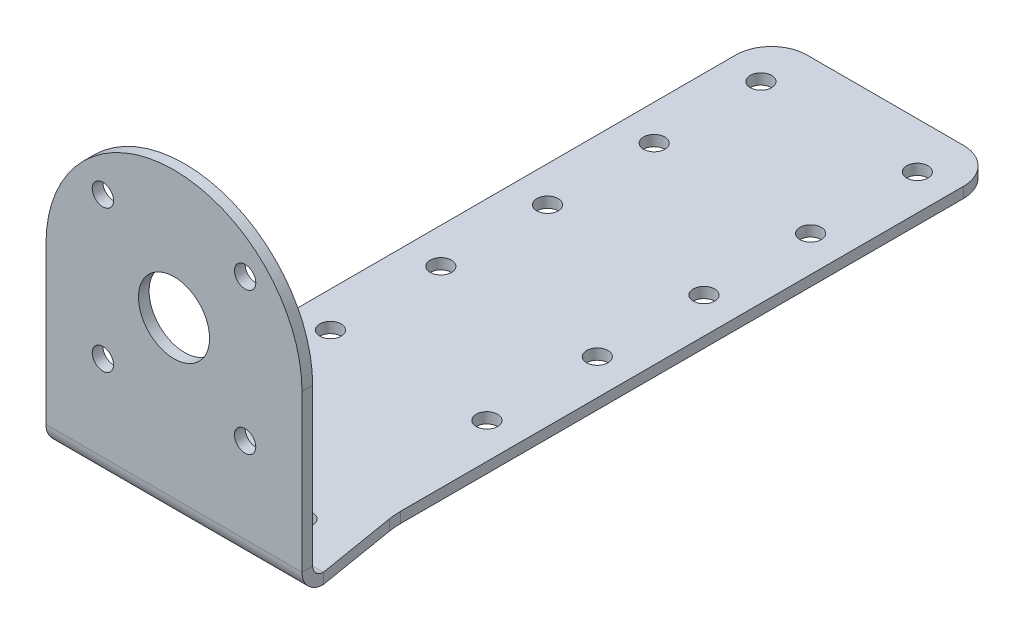
ISO-10303-21;
HEADER;
FILE_DESCRIPTION(('STEP AP214'),'2;1');
FILE_NAME('part.step','',(''),(''),'','','');
FILE_SCHEMA(('AUTOMOTIVE_DESIGN { 1 0 10303 214 1 1 1 1 }'));
ENDSEC;
DATA;
#1=APPLICATION_CONTEXT('core data for automotive mechanical design processes');
#2=APPLICATION_PROTOCOL_DEFINITION('international standard','automotive_design',2000,#1);
#3=PRODUCT_CONTEXT('',#1,'mechanical');
#4=PRODUCT('Part','Part','',(#3));
#5=PRODUCT_RELATED_PRODUCT_CATEGORY('part','',(#4));
#6=PRODUCT_DEFINITION_FORMATION('','',#4);
#7=PRODUCT_DEFINITION_CONTEXT('part definition',#1,'design');
#8=PRODUCT_DEFINITION('design','',#6,#7);
#9=PRODUCT_DEFINITION_SHAPE('','',#8);
#10=(LENGTH_UNIT() NAMED_UNIT(*) SI_UNIT(.MILLI.,.METRE.));
#11=(NAMED_UNIT(*) PLANE_ANGLE_UNIT() SI_UNIT($,.RADIAN.));
#12=(NAMED_UNIT(*) SI_UNIT($,.STERADIAN.) SOLID_ANGLE_UNIT());
#13=UNCERTAINTY_MEASURE_WITH_UNIT(LENGTH_MEASURE(1.E-05),#10,'distance_accuracy_value','');
#14=(GEOMETRIC_REPRESENTATION_CONTEXT(3) GLOBAL_UNCERTAINTY_ASSIGNED_CONTEXT((#13)) GLOBAL_UNIT_ASSIGNED_CONTEXT((#10,
#11,#12)) REPRESENTATION_CONTEXT('',''));
#15=CARTESIAN_POINT('',(0.,0.,0.));
#16=DIRECTION('',(0.,0.,1.));
#17=DIRECTION('',(1.,0.,0.));
#18=AXIS2_PLACEMENT_3D('',#15,#16,#17);
#19=CARTESIAN_POINT('',(0.,-12.5,0.));
#20=DIRECTION('',(0.,1.,0.));
#21=DIRECTION('',(0.,0.,1.));
#22=AXIS2_PLACEMENT_3D('',#19,#20,#21);
#23=PLANE('',#22);
#24=CARTESIAN_POINT('',(11.,-12.5000000000002,-62.02417469626));
#25=DIRECTION('',(0.,1.,0.));
#26=DIRECTION('',(0.,0.,1.));
#27=AXIS2_PLACEMENT_3D('',#24,#25,#26);
#28=CIRCLE('',#27,1.5);
#29=CARTESIAN_POINT('',(11.,-12.5000000000002,-60.52417469626));
#30=VERTEX_POINT('',#29);
#31=EDGE_CURVE('E212',#30,#30,#28,.T.);
#32=ORIENTED_EDGE('',*,*,#31,.T.);
#33=EDGE_LOOP('',(#32));
#34=FACE_BOUND('',#33,.T.);
#35=CARTESIAN_POINT('',(11.,-12.5000000000003,-77.02417469626));
#36=DIRECTION('',(0.,1.,0.));
#37=DIRECTION('',(0.,0.,1.));
#38=AXIS2_PLACEMENT_3D('',#35,#36,#37);
#39=CIRCLE('',#38,1.5);
#40=CARTESIAN_POINT('',(11.,-12.5000000000003,-75.52417469626));
#41=VERTEX_POINT('',#40);
#42=EDGE_CURVE('E533',#41,#41,#39,.T.);
#43=ORIENTED_EDGE('',*,*,#42,.T.);
#44=EDGE_LOOP('',(#43));
#45=FACE_BOUND('',#44,.T.);
#46=CARTESIAN_POINT('',(-11.,-12.5000000000003,-92.02417469626));
#47=DIRECTION('',(0.,1.,0.));
#48=DIRECTION('',(0.,0.,1.));
#49=AXIS2_PLACEMENT_3D('',#46,#47,#48);
#50=CIRCLE('',#49,1.5);
#51=CARTESIAN_POINT('',(-11.,-12.5000000000003,-90.52417469626));
#52=VERTEX_POINT('',#51);
#53=EDGE_CURVE('E530',#52,#52,#50,.T.);
#54=ORIENTED_EDGE('',*,*,#53,.T.);
#55=EDGE_LOOP('',(#54));
#56=FACE_BOUND('',#55,.T.);
#57=CARTESIAN_POINT('',(-11.,-12.5000000000003,-77.02417469626));
#58=DIRECTION('',(0.,1.,0.));
#59=DIRECTION('',(0.,0.,1.));
#60=AXIS2_PLACEMENT_3D('',#57,#58,#59);
#61=CIRCLE('',#60,1.5);
#62=CARTESIAN_POINT('',(-11.,-12.5000000000003,-75.52417469626));
#63=VERTEX_POINT('',#62);
#64=EDGE_CURVE('E527',#63,#63,#61,.T.);
#65=ORIENTED_EDGE('',*,*,#64,.T.);
#66=EDGE_LOOP('',(#65));
#67=FACE_BOUND('',#66,.T.);
#68=CARTESIAN_POINT('',(11.,-12.5000000000003,-92.02417469626));
#69=DIRECTION('',(0.,1.,0.));
#70=DIRECTION('',(0.,0.,1.));
#71=AXIS2_PLACEMENT_3D('',#68,#69,#70);
#72=CIRCLE('',#71,1.5);
#73=CARTESIAN_POINT('',(11.,-12.5000000000003,-90.52417469626));
#74=VERTEX_POINT('',#73);
#75=EDGE_CURVE('E524',#74,#74,#72,.T.);
#76=ORIENTED_EDGE('',*,*,#75,.T.);
#77=EDGE_LOOP('',(#76));
#78=FACE_BOUND('',#77,.T.);
#79=CARTESIAN_POINT('',(-11.,-12.5000000000001,-31.5));
#80=DIRECTION('',(0.,1.,0.));
#81=DIRECTION('',(0.,0.,1.));
#82=AXIS2_PLACEMENT_3D('',#79,#80,#81);
#83=CIRCLE('',#82,1.5);
#84=CARTESIAN_POINT('',(-11.,-12.5000000000001,-30.));
#85=VERTEX_POINT('',#84);
#86=EDGE_CURVE('E521',#85,#85,#83,.T.);
#87=ORIENTED_EDGE('',*,*,#86,.T.);
#88=EDGE_LOOP('',(#87));
#89=FACE_BOUND('',#88,.T.);
#90=CARTESIAN_POINT('',(-11.,-12.5000000000002,-47.02417469626));
#91=DIRECTION('',(0.,1.,0.));
#92=DIRECTION('',(0.,0.,1.));
#93=AXIS2_PLACEMENT_3D('',#90,#91,#92);
#94=CIRCLE('',#93,1.5);
#95=CARTESIAN_POINT('',(-11.,-12.5000000000002,-45.52417469626));
#96=VERTEX_POINT('',#95);
#97=EDGE_CURVE('E512',#96,#96,#94,.T.);
#98=ORIENTED_EDGE('',*,*,#97,.T.);
#99=EDGE_LOOP('',(#98));
#100=FACE_BOUND('',#99,.T.);
#101=CARTESIAN_POINT('',(-11.,-12.5000000000002,-62.02417469626));
#102=DIRECTION('',(0.,1.,0.));
#103=DIRECTION('',(0.,0.,1.));
#104=AXIS2_PLACEMENT_3D('',#101,#102,#103);
#105=CIRCLE('',#104,1.5);
#106=CARTESIAN_POINT('',(-11.,-12.5000000000002,-60.52417469626));
#107=VERTEX_POINT('',#106);
#108=EDGE_CURVE('E508',#107,#107,#105,.T.);
#109=ORIENTED_EDGE('',*,*,#108,.T.);
#110=EDGE_LOOP('',(#109));
#111=FACE_BOUND('',#110,.T.);
#112=CARTESIAN_POINT('',(11.,-12.5000000000002,-47.02417469626));
#113=DIRECTION('',(0.,1.,0.));
#114=DIRECTION('',(0.,0.,1.));
#115=AXIS2_PLACEMENT_3D('',#112,#113,#114);
#116=CIRCLE('',#115,1.5);
#117=CARTESIAN_POINT('',(11.,-12.5000000000002,-45.52417469626));
#118=VERTEX_POINT('',#117);
#119=EDGE_CURVE('E506',#118,#118,#116,.T.);
#120=ORIENTED_EDGE('',*,*,#119,.T.);
#121=EDGE_LOOP('',(#120));
#122=FACE_BOUND('',#121,.T.);
#123=CARTESIAN_POINT('',(11.,-12.5000000000001,-31.5));
#124=DIRECTION('',(0.,1.,0.));
#125=DIRECTION('',(0.,0.,1.));
#126=AXIS2_PLACEMENT_3D('',#123,#124,#125);
#127=CIRCLE('',#126,1.5);
#128=CARTESIAN_POINT('',(11.,-12.5000000000001,-30.));
#129=VERTEX_POINT('',#128);
#130=EDGE_CURVE('E509',#129,#129,#127,.T.);
#131=ORIENTED_EDGE('',*,*,#130,.T.);
#132=EDGE_LOOP('',(#131));
#133=FACE_BOUND('',#132,.T.);
#134=CARTESIAN_POINT('',(9.99999999999996,-12.5,-6.49999999999999));
#135=DIRECTION('',(0.,1.,0.));
#136=DIRECTION('',(0.,0.,1.));
#137=AXIS2_PLACEMENT_3D('',#134,#135,#136);
#138=CIRCLE('',#137,1.5);
#139=CARTESIAN_POINT('',(9.99999999999996,-12.5,-4.99999999999999));
#140=VERTEX_POINT('',#139);
#141=EDGE_CURVE('E515',#140,#140,#138,.T.);
#142=ORIENTED_EDGE('',*,*,#141,.T.);
#143=EDGE_LOOP('',(#142));
#144=FACE_BOUND('',#143,.T.);
#145=CARTESIAN_POINT('',(-10.,-12.5,-6.49999999999999));
#146=DIRECTION('',(0.,1.,0.));
#147=DIRECTION('',(0.,0.,1.));
#148=AXIS2_PLACEMENT_3D('',#145,#146,#147);
#149=CIRCLE('',#148,1.5);
#150=CARTESIAN_POINT('',(-10.,-12.5,-4.99999999999999));
#151=VERTEX_POINT('',#150);
#152=EDGE_CURVE('E559',#151,#151,#149,.T.);
#153=ORIENTED_EDGE('',*,*,#152,.T.);
#154=EDGE_LOOP('',(#153));
#155=FACE_BOUND('',#154,.T.);
#156=DIRECTION('',(-1.,0.,0.));
#157=VECTOR('',#156,1.);
#158=CARTESIAN_POINT('',(18.,-12.5,-1.49999999999999));
#159=LINE('',#158,#157);
#160=CARTESIAN_POINT('',(-18.,-12.5,-1.49999999999999));
#161=VERTEX_POINT('',#160);
#162=CARTESIAN_POINT('',(18.,-12.5,-1.49999999999999));
#163=VERTEX_POINT('',#162);
#164=EDGE_CURVE('E224',#161,#163,#159,.F.);
#165=ORIENTED_EDGE('',*,*,#164,.F.);
#166=DIRECTION('',(0.164398987305358,0.,-0.986393923832144));
#167=VECTOR('',#166,1.);
#168=CARTESIAN_POINT('',(-17.7567567567568,-12.5,-2.95945945945943));
#169=LINE('',#168,#167);
#170=CARTESIAN_POINT('',(-16.1360607616786,-12.5,-12.6836354299285));
#171=VERTEX_POINT('',#170);
#172=EDGE_CURVE('E183',#161,#171,#169,.T.);
#173=ORIENTED_EDGE('',*,*,#172,.T.);
#174=CARTESIAN_POINT('',(-26.,-12.5,-14.3276253029821));
#175=DIRECTION('',(0.,1.,0.));
#176=DIRECTION('',(0.,0.,1.));
#177=AXIS2_PLACEMENT_3D('',#174,#175,#176);
#178=CIRCLE('',#177,10.);
#179=CARTESIAN_POINT('',(-16.,-12.5,-14.3276253029821));
#180=VERTEX_POINT('',#179);
#181=EDGE_CURVE('E169',#171,#180,#178,.T.);
#182=ORIENTED_EDGE('',*,*,#181,.T.);
#183=DIRECTION('',(0.,0.,-1.));
#184=VECTOR('',#183,1.);
#185=CARTESIAN_POINT('',(-16.,-12.5,0.));
#186=LINE('',#185,#184);
#187=CARTESIAN_POINT('',(-16.,-12.5000000000003,-93.5));
#188=VERTEX_POINT('',#187);
#189=EDGE_CURVE('E160',#180,#188,#186,.T.);
#190=ORIENTED_EDGE('',*,*,#189,.T.);
#191=CARTESIAN_POINT('',(-11.,-12.5000000000003,-93.5));
#192=DIRECTION('',(0.,1.,0.));
#193=DIRECTION('',(0.,0.,1.));
#194=AXIS2_PLACEMENT_3D('',#191,#192,#193);
#195=CIRCLE('',#194,4.99999999999999);
#196=CARTESIAN_POINT('',(-11.,-12.5000000000003,-98.5));
#197=VERTEX_POINT('',#196);
#198=EDGE_CURVE('E165',#188,#197,#195,.F.);
#199=ORIENTED_EDGE('',*,*,#198,.T.);
#200=DIRECTION('',(1.,0.,0.));
#201=VECTOR('',#200,1.);
#202=CARTESIAN_POINT('',(0.,-12.5000000000003,-98.5));
#203=LINE('',#202,#201);
#204=CARTESIAN_POINT('',(11.,-12.5000000000003,-98.5));
#205=VERTEX_POINT('',#204);
#206=EDGE_CURVE('E218',#197,#205,#203,.T.);
#207=ORIENTED_EDGE('',*,*,#206,.T.);
#208=CARTESIAN_POINT('',(11.,-12.5000000000003,-93.5));
#209=DIRECTION('',(0.,1.,0.));
#210=DIRECTION('',(0.,0.,1.));
#211=AXIS2_PLACEMENT_3D('',#208,#209,#210);
#212=CIRCLE('',#211,4.99999999999999);
#213=CARTESIAN_POINT('',(16.,-12.5000000000003,-93.5));
#214=VERTEX_POINT('',#213);
#215=EDGE_CURVE('E199',#214,#205,#212,.T.);
#216=ORIENTED_EDGE('',*,*,#215,.F.);
#217=DIRECTION('',(0.,0.,-1.));
#218=VECTOR('',#217,1.);
#219=CARTESIAN_POINT('',(16.,-12.5,0.));
#220=LINE('',#219,#218);
#221=CARTESIAN_POINT('',(16.,-12.5,-14.3276253029821));
#222=VERTEX_POINT('',#221);
#223=EDGE_CURVE('E201',#222,#214,#220,.T.);
#224=ORIENTED_EDGE('',*,*,#223,.F.);
#225=CARTESIAN_POINT('',(26.,-12.5,-14.3276253029821));
#226=DIRECTION('',(0.,1.,0.));
#227=DIRECTION('',(0.,0.,1.));
#228=AXIS2_PLACEMENT_3D('',#225,#226,#227);
#229=CIRCLE('',#228,10.);
#230=CARTESIAN_POINT('',(16.1360607616786,-12.5,-12.6836354299285));
#231=VERTEX_POINT('',#230);
#232=EDGE_CURVE('E13',#222,#231,#229,.T.);
#233=ORIENTED_EDGE('',*,*,#232,.T.);
#234=DIRECTION('',(-0.164398987305358,0.,-0.986393923832144));
#235=VECTOR('',#234,1.);
#236=CARTESIAN_POINT('',(17.7567567567568,-12.5,-2.95945945945942));
#237=LINE('',#236,#235);
#238=EDGE_CURVE('E204',#163,#231,#237,.T.);
#239=ORIENTED_EDGE('',*,*,#238,.F.);
#240=EDGE_LOOP('',(#165,#173,#182,#190,#199,#207,#216,#224,#233,#239));
#241=FACE_BOUND('',#240,.T.);
#242=ADVANCED_FACE('F61',(#34,#45,#56,#67,#78,#89,#100,#111,#122,#133,#144,#155,#241),#23,.F.);
#243=CARTESIAN_POINT('',(0.,-11.,0.));
#244=DIRECTION('',(0.,1.,0.));
#245=DIRECTION('',(0.,0.,1.));
#246=AXIS2_PLACEMENT_3D('',#243,#244,#245);
#247=PLANE('',#246);
#248=CARTESIAN_POINT('',(11.,-11.0000000000002,-62.02417469626));
#249=DIRECTION('',(0.,1.,0.));
#250=DIRECTION('',(0.,0.,-1.));
#251=AXIS2_PLACEMENT_3D('',#248,#249,#250);
#252=CIRCLE('',#251,1.5);
#253=CARTESIAN_POINT('',(11.,-11.0000000000002,-63.52417469626));
#254=VERTEX_POINT('',#253);
#255=EDGE_CURVE('E579',#254,#254,#252,.T.);
#256=ORIENTED_EDGE('',*,*,#255,.F.);
#257=EDGE_LOOP('',(#256));
#258=FACE_BOUND('',#257,.T.);
#259=CARTESIAN_POINT('',(11.,-11.0000000000003,-77.02417469626));
#260=DIRECTION('',(0.,1.,0.));
#261=DIRECTION('',(0.,0.,-1.));
#262=AXIS2_PLACEMENT_3D('',#259,#260,#261);
#263=CIRCLE('',#262,1.5);
#264=CARTESIAN_POINT('',(11.,-11.0000000000003,-78.52417469626));
#265=VERTEX_POINT('',#264);
#266=EDGE_CURVE('E582',#265,#265,#263,.T.);
#267=ORIENTED_EDGE('',*,*,#266,.F.);
#268=EDGE_LOOP('',(#267));
#269=FACE_BOUND('',#268,.T.);
#270=CARTESIAN_POINT('',(-11.,-11.0000000000003,-92.02417469626));
#271=DIRECTION('',(0.,1.,0.));
#272=DIRECTION('',(0.,0.,1.));
#273=AXIS2_PLACEMENT_3D('',#270,#271,#272);
#274=CIRCLE('',#273,1.5);
#275=CARTESIAN_POINT('',(-11.,-11.0000000000003,-90.52417469626));
#276=VERTEX_POINT('',#275);
#277=EDGE_CURVE('E585',#276,#276,#274,.T.);
#278=ORIENTED_EDGE('',*,*,#277,.F.);
#279=EDGE_LOOP('',(#278));
#280=FACE_BOUND('',#279,.T.);
#281=CARTESIAN_POINT('',(-11.,-11.0000000000003,-77.02417469626));
#282=DIRECTION('',(0.,1.,0.));
#283=DIRECTION('',(0.,0.,1.));
#284=AXIS2_PLACEMENT_3D('',#281,#282,#283);
#285=CIRCLE('',#284,1.5);
#286=CARTESIAN_POINT('',(-11.,-11.0000000000003,-75.52417469626));
#287=VERTEX_POINT('',#286);
#288=EDGE_CURVE('E576',#287,#287,#285,.T.);
#289=ORIENTED_EDGE('',*,*,#288,.F.);
#290=EDGE_LOOP('',(#289));
#291=FACE_BOUND('',#290,.T.);
#292=CARTESIAN_POINT('',(11.,-11.0000000000003,-92.02417469626));
#293=DIRECTION('',(0.,1.,0.));
#294=DIRECTION('',(0.,0.,-1.));
#295=AXIS2_PLACEMENT_3D('',#292,#293,#294);
#296=CIRCLE('',#295,1.5);
#297=CARTESIAN_POINT('',(11.,-11.0000000000003,-93.52417469626));
#298=VERTEX_POINT('',#297);
#299=EDGE_CURVE('E564',#298,#298,#296,.T.);
#300=ORIENTED_EDGE('',*,*,#299,.F.);
#301=EDGE_LOOP('',(#300));
#302=FACE_BOUND('',#301,.T.);
#303=CARTESIAN_POINT('',(-11.,-11.0000000000001,-31.5));
#304=DIRECTION('',(0.,1.,0.));
#305=DIRECTION('',(0.,0.,1.));
#306=AXIS2_PLACEMENT_3D('',#303,#304,#305);
#307=CIRCLE('',#306,1.5);
#308=CARTESIAN_POINT('',(-11.,-11.0000000000001,-30.));
#309=VERTEX_POINT('',#308);
#310=EDGE_CURVE('E567',#309,#309,#307,.T.);
#311=ORIENTED_EDGE('',*,*,#310,.F.);
#312=EDGE_LOOP('',(#311));
#313=FACE_BOUND('',#312,.T.);
#314=CARTESIAN_POINT('',(-11.,-11.0000000000002,-47.02417469626));
#315=DIRECTION('',(0.,1.,0.));
#316=DIRECTION('',(0.,0.,1.));
#317=AXIS2_PLACEMENT_3D('',#314,#315,#316);
#318=CIRCLE('',#317,1.5);
#319=CARTESIAN_POINT('',(-11.,-11.0000000000002,-45.52417469626));
#320=VERTEX_POINT('',#319);
#321=EDGE_CURVE('E570',#320,#320,#318,.T.);
#322=ORIENTED_EDGE('',*,*,#321,.F.);
#323=EDGE_LOOP('',(#322));
#324=FACE_BOUND('',#323,.T.);
#325=CARTESIAN_POINT('',(-11.,-11.0000000000002,-62.02417469626));
#326=DIRECTION('',(0.,1.,0.));
#327=DIRECTION('',(0.,0.,1.));
#328=AXIS2_PLACEMENT_3D('',#325,#326,#327);
#329=CIRCLE('',#328,1.5);
#330=CARTESIAN_POINT('',(-11.,-11.0000000000002,-60.52417469626));
#331=VERTEX_POINT('',#330);
#332=EDGE_CURVE('E573',#331,#331,#329,.T.);
#333=ORIENTED_EDGE('',*,*,#332,.F.);
#334=EDGE_LOOP('',(#333));
#335=FACE_BOUND('',#334,.T.);
#336=CARTESIAN_POINT('',(11.,-11.0000000000002,-47.02417469626));
#337=DIRECTION('',(0.,1.,0.));
#338=DIRECTION('',(0.,0.,-1.));
#339=AXIS2_PLACEMENT_3D('',#336,#337,#338);
#340=CIRCLE('',#339,1.5);
#341=CARTESIAN_POINT('',(11.,-11.0000000000002,-48.52417469626));
#342=VERTEX_POINT('',#341);
#343=EDGE_CURVE('E503',#342,#342,#340,.T.);
#344=ORIENTED_EDGE('',*,*,#343,.F.);
#345=EDGE_LOOP('',(#344));
#346=FACE_BOUND('',#345,.T.);
#347=CARTESIAN_POINT('',(11.,-11.0000000000001,-31.5));
#348=DIRECTION('',(0.,1.,0.));
#349=DIRECTION('',(0.,0.,-1.));
#350=AXIS2_PLACEMENT_3D('',#347,#348,#349);
#351=CIRCLE('',#350,1.5);
#352=CARTESIAN_POINT('',(11.,-11.0000000000001,-33.));
#353=VERTEX_POINT('',#352);
#354=EDGE_CURVE('E593',#353,#353,#351,.T.);
#355=ORIENTED_EDGE('',*,*,#354,.F.);
#356=EDGE_LOOP('',(#355));
#357=FACE_BOUND('',#356,.T.);
#358=CARTESIAN_POINT('',(9.99999999999996,-11.,-6.5));
#359=DIRECTION('',(0.,1.,0.));
#360=DIRECTION('',(0.,0.,-1.));
#361=AXIS2_PLACEMENT_3D('',#358,#359,#360);
#362=CIRCLE('',#361,1.5);
#363=CARTESIAN_POINT('',(9.99999999999996,-11.,-8.));
#364=VERTEX_POINT('',#363);
#365=EDGE_CURVE('E590',#364,#364,#362,.T.);
#366=ORIENTED_EDGE('',*,*,#365,.F.);
#367=EDGE_LOOP('',(#366));
#368=FACE_BOUND('',#367,.T.);
#369=CARTESIAN_POINT('',(-10.,-11.,-6.5));
#370=DIRECTION('',(0.,1.,0.));
#371=DIRECTION('',(0.,0.,1.));
#372=AXIS2_PLACEMENT_3D('',#369,#370,#371);
#373=CIRCLE('',#372,1.5);
#374=CARTESIAN_POINT('',(-10.,-11.,-5.));
#375=VERTEX_POINT('',#374);
#376=EDGE_CURVE('E561',#375,#375,#373,.T.);
#377=ORIENTED_EDGE('',*,*,#376,.F.);
#378=EDGE_LOOP('',(#377));
#379=FACE_BOUND('',#378,.T.);
#380=DIRECTION('',(0.164398987305358,0.,-0.986393923832144));
#381=VECTOR('',#380,1.);
#382=CARTESIAN_POINT('',(-17.7567567567568,-11.,-2.95945945945944));
#383=LINE('',#382,#381);
#384=CARTESIAN_POINT('',(-18.,-11.,-1.49999999999999));
#385=VERTEX_POINT('',#384);
#386=CARTESIAN_POINT('',(-16.1360607616786,-11.,-12.6836354299285));
#387=VERTEX_POINT('',#386);
#388=EDGE_CURVE('E173',#385,#387,#383,.T.);
#389=ORIENTED_EDGE('',*,*,#388,.F.);
#390=DIRECTION('',(-1.,0.,0.));
#391=VECTOR('',#390,1.);
#392=CARTESIAN_POINT('',(18.,-11.,-1.49999999999999));
#393=LINE('',#392,#391);
#394=CARTESIAN_POINT('',(18.,-11.,-1.49999999999999));
#395=VERTEX_POINT('',#394);
#396=EDGE_CURVE('E230',#395,#385,#393,.T.);
#397=ORIENTED_EDGE('',*,*,#396,.F.);
#398=DIRECTION('',(-0.164398987305358,0.,-0.986393923832144));
#399=VECTOR('',#398,1.);
#400=CARTESIAN_POINT('',(17.7567567567568,-11.,-2.95945945945943));
#401=LINE('',#400,#399);
#402=CARTESIAN_POINT('',(16.1360607616786,-11.,-12.6836354299285));
#403=VERTEX_POINT('',#402);
#404=EDGE_CURVE('E202',#395,#403,#401,.T.);
#405=ORIENTED_EDGE('',*,*,#404,.T.);
#406=CARTESIAN_POINT('',(26.,-11.,-14.3276253029821));
#407=DIRECTION('',(0.,1.,0.));
#408=DIRECTION('',(0.,0.,1.));
#409=AXIS2_PLACEMENT_3D('',#406,#407,#408);
#410=CIRCLE('',#409,10.);
#411=CARTESIAN_POINT('',(16.,-11.,-14.3276253029821));
#412=VERTEX_POINT('',#411);
#413=EDGE_CURVE('E69',#403,#412,#410,.F.);
#414=ORIENTED_EDGE('',*,*,#413,.T.);
#415=DIRECTION('',(0.,0.,-1.));
#416=VECTOR('',#415,1.);
#417=CARTESIAN_POINT('',(16.,-11.,0.));
#418=LINE('',#417,#416);
#419=CARTESIAN_POINT('',(16.,-11.0000000000003,-93.5));
#420=VERTEX_POINT('',#419);
#421=EDGE_CURVE('E211',#412,#420,#418,.T.);
#422=ORIENTED_EDGE('',*,*,#421,.T.);
#423=CARTESIAN_POINT('',(11.,-11.0000000000003,-93.5));
#424=DIRECTION('',(0.,1.,0.));
#425=DIRECTION('',(0.,0.,1.));
#426=AXIS2_PLACEMENT_3D('',#423,#424,#425);
#427=CIRCLE('',#426,4.99999999999999);
#428=CARTESIAN_POINT('',(11.,-11.0000000000003,-98.5));
#429=VERTEX_POINT('',#428);
#430=EDGE_CURVE('E208',#420,#429,#427,.T.);
#431=ORIENTED_EDGE('',*,*,#430,.T.);
#432=DIRECTION('',(-1.,0.,0.));
#433=VECTOR('',#432,1.);
#434=CARTESIAN_POINT('',(18.,-11.0000000000003,-98.5));
#435=LINE('',#434,#433);
#436=CARTESIAN_POINT('',(-11.,-11.0000000000003,-98.5));
#437=VERTEX_POINT('',#436);
#438=EDGE_CURVE('E221',#437,#429,#435,.F.);
#439=ORIENTED_EDGE('',*,*,#438,.F.);
#440=CARTESIAN_POINT('',(-11.,-11.0000000000003,-93.5));
#441=DIRECTION('',(0.,1.,0.));
#442=DIRECTION('',(0.,0.,1.));
#443=AXIS2_PLACEMENT_3D('',#440,#441,#442);
#444=CIRCLE('',#443,4.99999999999999);
#445=CARTESIAN_POINT('',(-16.,-11.0000000000003,-93.5));
#446=VERTEX_POINT('',#445);
#447=EDGE_CURVE('E192',#446,#437,#444,.F.);
#448=ORIENTED_EDGE('',*,*,#447,.F.);
#449=DIRECTION('',(0.,0.,-1.));
#450=VECTOR('',#449,1.);
#451=CARTESIAN_POINT('',(-16.,-11.,0.));
#452=LINE('',#451,#450);
#453=CARTESIAN_POINT('',(-16.,-11.,-14.3276253029821));
#454=VERTEX_POINT('',#453);
#455=EDGE_CURVE('E179',#454,#446,#452,.T.);
#456=ORIENTED_EDGE('',*,*,#455,.F.);
#457=CARTESIAN_POINT('',(-26.,-11.,-14.3276253029821));
#458=DIRECTION('',(0.,1.,0.));
#459=DIRECTION('',(0.,0.,1.));
#460=AXIS2_PLACEMENT_3D('',#457,#458,#459);
#461=CIRCLE('',#460,10.);
#462=EDGE_CURVE('E316',#454,#387,#461,.F.);
#463=ORIENTED_EDGE('',*,*,#462,.T.);
#464=EDGE_LOOP('',(#389,#397,#405,#414,#422,#431,#439,#448,#456,#463));
#465=FACE_BOUND('',#464,.T.);
#466=ADVANCED_FACE('F319',(#258,#269,#280,#291,#302,#313,#324,#335,#346,#357,#368,#379,#465),
#247,.T.);
#467=CARTESIAN_POINT('',(18.,-12.5000000000003,-98.5));
#468=DIRECTION('',(0.,0.,1.));
#469=DIRECTION('',(0.,-1.,0.));
#470=AXIS2_PLACEMENT_3D('',#467,#468,#469);
#471=PLANE('',#470);
#472=DIRECTION('',(0.,1.,0.));
#473=VECTOR('',#472,1.);
#474=CARTESIAN_POINT('',(-11.,-12.5000000000003,-98.5));
#475=LINE('',#474,#473);
#476=EDGE_CURVE('E182',#197,#437,#475,.T.);
#477=ORIENTED_EDGE('',*,*,#476,.T.);
#478=ORIENTED_EDGE('',*,*,#438,.T.);
#479=DIRECTION('',(0.,1.,0.));
#480=VECTOR('',#479,1.);
#481=CARTESIAN_POINT('',(11.,-12.5000000000003,-98.5));
#482=LINE('',#481,#480);
#483=EDGE_CURVE('E193',#205,#429,#482,.T.);
#484=ORIENTED_EDGE('',*,*,#483,.F.);
#485=ORIENTED_EDGE('',*,*,#206,.F.);
#486=EDGE_LOOP('',(#477,#478,#484,#485));
#487=FACE_BOUND('',#486,.T.);
#488=ADVANCED_FACE('F341',(#487),#471,.F.);
#489=CARTESIAN_POINT('',(-18.,0.,0.));
#490=DIRECTION('',(-1.,0.,0.));
#491=DIRECTION('',(0.,-1.,0.));
#492=AXIS2_PLACEMENT_3D('',#489,#490,#491);
#493=PLANE('',#492);
#494=DIRECTION('',(0.,-1.,0.));
#495=VECTOR('',#494,1.);
#496=CARTESIAN_POINT('',(-18.,0.,0.));
#497=LINE('',#496,#495);
#498=CARTESIAN_POINT('',(-18.,12.5,0.));
#499=VERTEX_POINT('',#498);
#500=CARTESIAN_POINT('',(-18.,-9.50000000000001,0.));
#501=VERTEX_POINT('',#500);
#502=EDGE_CURVE('E264',#499,#501,#497,.T.);
#503=ORIENTED_EDGE('',*,*,#502,.T.);
#504=DIRECTION('',(0.,0.,1.));
#505=VECTOR('',#504,1.);
#506=CARTESIAN_POINT('',(-18.,-9.50000000000001,0.));
#507=LINE('',#506,#505);
#508=CARTESIAN_POINT('',(-18.,-9.50000000000001,1.5));
#509=VERTEX_POINT('',#508);
#510=EDGE_CURVE('E241',#501,#509,#507,.T.);
#511=ORIENTED_EDGE('',*,*,#510,.T.);
#512=DIRECTION('',(0.,1.,0.));
#513=VECTOR('',#512,1.);
#514=CARTESIAN_POINT('',(-18.,0.,1.5));
#515=LINE('',#514,#513);
#516=CARTESIAN_POINT('',(-18.,12.5,1.5));
#517=VERTEX_POINT('',#516);
#518=EDGE_CURVE('E286',#517,#509,#515,.F.);
#519=ORIENTED_EDGE('',*,*,#518,.F.);
#520=DIRECTION('',(0.,0.,-1.));
#521=VECTOR('',#520,1.);
#522=CARTESIAN_POINT('',(-18.,12.5,0.));
#523=LINE('',#522,#521);
#524=EDGE_CURVE('E305',#517,#499,#523,.T.);
#525=ORIENTED_EDGE('',*,*,#524,.T.);
#526=EDGE_LOOP('',(#503,#511,#519,#525));
#527=FACE_BOUND('',#526,.T.);
#528=ADVANCED_FACE('F352',(#527),#493,.T.);
#529=CARTESIAN_POINT('',(0.,0.,0.));
#530=DIRECTION('',(0.,0.,1.));
#531=DIRECTION('',(1.,0.,0.));
#532=AXIS2_PLACEMENT_3D('',#529,#530,#531);
#533=PLANE('',#532);
#534=CARTESIAN_POINT('',(-9.99999999999999,2.5,0.));
#535=DIRECTION('',(0.,0.,1.));
#536=DIRECTION('',(1.,0.,0.));
#537=AXIS2_PLACEMENT_3D('',#534,#535,#536);
#538=CIRCLE('',#537,1.5);
#539=CARTESIAN_POINT('',(-8.49999999999999,2.5,0.));
#540=VERTEX_POINT('',#539);
#541=EDGE_CURVE('E279',#540,#540,#538,.T.);
#542=ORIENTED_EDGE('',*,*,#541,.T.);
#543=EDGE_LOOP('',(#542));
#544=FACE_BOUND('',#543,.T.);
#545=CARTESIAN_POINT('',(10.,2.5,0.));
#546=DIRECTION('',(0.,0.,1.));
#547=DIRECTION('',(1.,0.,0.));
#548=AXIS2_PLACEMENT_3D('',#545,#546,#547);
#549=CIRCLE('',#548,1.5);
#550=CARTESIAN_POINT('',(11.5,2.5,0.));
#551=VERTEX_POINT('',#550);
#552=EDGE_CURVE('E276',#551,#551,#549,.T.);
#553=ORIENTED_EDGE('',*,*,#552,.T.);
#554=EDGE_LOOP('',(#553));
#555=FACE_BOUND('',#554,.T.);
#556=CARTESIAN_POINT('',(-9.99999999999999,22.5,0.));
#557=DIRECTION('',(0.,0.,1.));
#558=DIRECTION('',(1.,0.,0.));
#559=AXIS2_PLACEMENT_3D('',#556,#557,#558);
#560=CIRCLE('',#559,1.5);
#561=CARTESIAN_POINT('',(-8.49999999999999,22.5,0.));
#562=VERTEX_POINT('',#561);
#563=EDGE_CURVE('E273',#562,#562,#560,.T.);
#564=ORIENTED_EDGE('',*,*,#563,.T.);
#565=EDGE_LOOP('',(#564));
#566=FACE_BOUND('',#565,.T.);
#567=CARTESIAN_POINT('',(0.,12.5,0.));
#568=DIRECTION('',(0.,0.,1.));
#569=DIRECTION('',(1.,0.,0.));
#570=AXIS2_PLACEMENT_3D('',#567,#568,#569);
#571=CIRCLE('',#570,5.);
#572=CARTESIAN_POINT('',(5.00000000000001,12.5,0.));
#573=VERTEX_POINT('',#572);
#574=EDGE_CURVE('E270',#573,#573,#571,.T.);
#575=ORIENTED_EDGE('',*,*,#574,.T.);
#576=EDGE_LOOP('',(#575));
#577=FACE_BOUND('',#576,.T.);
#578=CARTESIAN_POINT('',(10.,22.5,0.));
#579=DIRECTION('',(0.,0.,1.));
#580=DIRECTION('',(1.,0.,0.));
#581=AXIS2_PLACEMENT_3D('',#578,#579,#580);
#582=CIRCLE('',#581,1.5);
#583=CARTESIAN_POINT('',(11.5,22.5,0.));
#584=VERTEX_POINT('',#583);
#585=EDGE_CURVE('E267',#584,#584,#582,.T.);
#586=ORIENTED_EDGE('',*,*,#585,.T.);
#587=EDGE_LOOP('',(#586));
#588=FACE_BOUND('',#587,.T.);
#589=DIRECTION('',(-1.,0.,0.));
#590=VECTOR('',#589,1.);
#591=CARTESIAN_POINT('',(-18.,-9.50000000000001,0.));
#592=LINE('',#591,#590);
#593=CARTESIAN_POINT('',(18.,-9.50000000000001,0.));
#594=VERTEX_POINT('',#593);
#595=EDGE_CURVE('E247',#501,#594,#592,.F.);
#596=ORIENTED_EDGE('',*,*,#595,.F.);
#597=ORIENTED_EDGE('',*,*,#502,.F.);
#598=CARTESIAN_POINT('',(0.,12.5,0.));
#599=DIRECTION('',(0.,0.,1.));
#600=DIRECTION('',(1.,0.,0.));
#601=AXIS2_PLACEMENT_3D('',#598,#599,#600);
#602=CIRCLE('',#601,18.);
#603=CARTESIAN_POINT('',(18.,12.5,0.));
#604=VERTEX_POINT('',#603);
#605=EDGE_CURVE('E257',#604,#499,#602,.T.);
#606=ORIENTED_EDGE('',*,*,#605,.F.);
#607=DIRECTION('',(0.,-1.,0.));
#608=VECTOR('',#607,1.);
#609=CARTESIAN_POINT('',(18.,0.,0.));
#610=LINE('',#609,#608);
#611=EDGE_CURVE('E260',#604,#594,#610,.T.);
#612=ORIENTED_EDGE('',*,*,#611,.T.);
#613=EDGE_LOOP('',(#596,#597,#606,#612));
#614=FACE_BOUND('',#613,.T.);
#615=ADVANCED_FACE('F371',(#544,#555,#566,#577,#588,#614),#533,.F.);
#616=CARTESIAN_POINT('',(0.,0.,1.5));
#617=DIRECTION('',(0.,0.,1.));
#618=DIRECTION('',(1.,0.,0.));
#619=AXIS2_PLACEMENT_3D('',#616,#617,#618);
#620=PLANE('',#619);
#621=CARTESIAN_POINT('',(10.,22.5,1.5));
#622=DIRECTION('',(0.,0.,1.));
#623=DIRECTION('',(1.,0.,0.));
#624=AXIS2_PLACEMENT_3D('',#621,#622,#623);
#625=CIRCLE('',#624,1.5);
#626=CARTESIAN_POINT('',(11.5,22.5,1.5));
#627=VERTEX_POINT('',#626);
#628=EDGE_CURVE('E289',#627,#627,#625,.T.);
#629=ORIENTED_EDGE('',*,*,#628,.F.);
#630=EDGE_LOOP('',(#629));
#631=FACE_BOUND('',#630,.T.);
#632=CARTESIAN_POINT('',(0.,12.5,1.5));
#633=DIRECTION('',(0.,0.,1.));
#634=DIRECTION('',(1.,0.,0.));
#635=AXIS2_PLACEMENT_3D('',#632,#633,#634);
#636=CIRCLE('',#635,5.);
#637=CARTESIAN_POINT('',(5.00000000000001,12.5,1.5));
#638=VERTEX_POINT('',#637);
#639=EDGE_CURVE('E294',#638,#638,#636,.T.);
#640=ORIENTED_EDGE('',*,*,#639,.F.);
#641=EDGE_LOOP('',(#640));
#642=FACE_BOUND('',#641,.T.);
#643=CARTESIAN_POINT('',(-9.99999999999999,22.5,1.5));
#644=DIRECTION('',(0.,0.,1.));
#645=DIRECTION('',(1.,0.,0.));
#646=AXIS2_PLACEMENT_3D('',#643,#644,#645);
#647=CIRCLE('',#646,1.5);
#648=CARTESIAN_POINT('',(-8.49999999999999,22.5,1.5));
#649=VERTEX_POINT('',#648);
#650=EDGE_CURVE('E297',#649,#649,#647,.T.);
#651=ORIENTED_EDGE('',*,*,#650,.F.);
#652=EDGE_LOOP('',(#651));
#653=FACE_BOUND('',#652,.T.);
#654=CARTESIAN_POINT('',(10.,2.5,1.5));
#655=DIRECTION('',(0.,0.,1.));
#656=DIRECTION('',(1.,0.,0.));
#657=AXIS2_PLACEMENT_3D('',#654,#655,#656);
#658=CIRCLE('',#657,1.5);
#659=CARTESIAN_POINT('',(11.5,2.5,1.5));
#660=VERTEX_POINT('',#659);
#661=EDGE_CURVE('E300',#660,#660,#658,.T.);
#662=ORIENTED_EDGE('',*,*,#661,.F.);
#663=EDGE_LOOP('',(#662));
#664=FACE_BOUND('',#663,.T.);
#665=CARTESIAN_POINT('',(-9.99999999999999,2.5,1.5));
#666=DIRECTION('',(0.,0.,1.));
#667=DIRECTION('',(1.,0.,0.));
#668=AXIS2_PLACEMENT_3D('',#665,#666,#667);
#669=CIRCLE('',#668,1.5);
#670=CARTESIAN_POINT('',(-8.49999999999999,2.5,1.5));
#671=VERTEX_POINT('',#670);
#672=EDGE_CURVE('E261',#671,#671,#669,.T.);
#673=ORIENTED_EDGE('',*,*,#672,.F.);
#674=EDGE_LOOP('',(#673));
#675=FACE_BOUND('',#674,.T.);
#676=ORIENTED_EDGE('',*,*,#518,.T.);
#677=DIRECTION('',(-1.,0.,0.));
#678=VECTOR('',#677,1.);
#679=CARTESIAN_POINT('',(-18.,-9.50000000000001,1.5));
#680=LINE('',#679,#678);
#681=CARTESIAN_POINT('',(18.,-9.50000000000001,1.5));
#682=VERTEX_POINT('',#681);
#683=EDGE_CURVE('E234',#509,#682,#680,.F.);
#684=ORIENTED_EDGE('',*,*,#683,.T.);
#685=DIRECTION('',(0.,1.,0.));
#686=VECTOR('',#685,1.);
#687=CARTESIAN_POINT('',(18.,0.,1.5));
#688=LINE('',#687,#686);
#689=CARTESIAN_POINT('',(18.,12.5,1.5));
#690=VERTEX_POINT('',#689);
#691=EDGE_CURVE('E285',#690,#682,#688,.F.);
#692=ORIENTED_EDGE('',*,*,#691,.F.);
#693=CARTESIAN_POINT('',(0.,12.5,1.5));
#694=DIRECTION('',(0.,0.,1.));
#695=DIRECTION('',(1.,0.,0.));
#696=AXIS2_PLACEMENT_3D('',#693,#694,#695);
#697=CIRCLE('',#696,18.);
#698=EDGE_CURVE('E254',#690,#517,#697,.T.);
#699=ORIENTED_EDGE('',*,*,#698,.T.);
#700=EDGE_LOOP('',(#676,#684,#692,#699));
#701=FACE_BOUND('',#700,.T.);
#702=ADVANCED_FACE('F374',(#631,#642,#653,#664,#675,#701),#620,.T.);
#703=CARTESIAN_POINT('',(0.,12.5,0.));
#704=DIRECTION('',(0.,0.,1.));
#705=DIRECTION('',(1.,0.,0.));
#706=AXIS2_PLACEMENT_3D('',#703,#704,#705);
#707=CYLINDRICAL_SURFACE('',#706,18.);
#708=ORIENTED_EDGE('',*,*,#524,.F.);
#709=ORIENTED_EDGE('',*,*,#698,.F.);
#710=DIRECTION('',(0.,0.,-1.));
#711=VECTOR('',#710,1.);
#712=CARTESIAN_POINT('',(18.,12.5,0.));
#713=LINE('',#712,#711);
#714=EDGE_CURVE('E282',#690,#604,#713,.T.);
#715=ORIENTED_EDGE('',*,*,#714,.T.);
#716=ORIENTED_EDGE('',*,*,#605,.T.);
#717=EDGE_LOOP('',(#708,#709,#715,#716));
#718=FACE_BOUND('',#717,.T.);
#719=ADVANCED_FACE('F378',(#718),#707,.T.);
#720=CARTESIAN_POINT('',(18.,0.,0.));
#721=DIRECTION('',(-1.,0.,0.));
#722=DIRECTION('',(0.,-1.,0.));
#723=AXIS2_PLACEMENT_3D('',#720,#721,#722);
#724=PLANE('',#723);
#725=DIRECTION('',(0.,0.,1.));
#726=VECTOR('',#725,1.);
#727=CARTESIAN_POINT('',(18.,-9.50000000000001,0.));
#728=LINE('',#727,#726);
#729=EDGE_CURVE('E251',#594,#682,#728,.T.);
#730=ORIENTED_EDGE('',*,*,#729,.F.);
#731=ORIENTED_EDGE('',*,*,#611,.F.);
#732=ORIENTED_EDGE('',*,*,#714,.F.);
#733=ORIENTED_EDGE('',*,*,#691,.T.);
#734=EDGE_LOOP('',(#730,#731,#732,#733));
#735=FACE_BOUND('',#734,.T.);
#736=ADVANCED_FACE('F382',(#735),#724,.F.);
#737=CARTESIAN_POINT('',(10.,22.5,0.));
#738=DIRECTION('',(0.,0.,1.));
#739=DIRECTION('',(1.,0.,0.));
#740=AXIS2_PLACEMENT_3D('',#737,#738,#739);
#741=CYLINDRICAL_SURFACE('',#740,1.5);
#742=ORIENTED_EDGE('',*,*,#585,.F.);
#743=EDGE_LOOP('',(#742));
#744=FACE_BOUND('',#743,.T.);
#745=ORIENTED_EDGE('',*,*,#628,.T.);
#746=EDGE_LOOP('',(#745));
#747=FACE_BOUND('',#746,.T.);
#748=ADVANCED_FACE('F389',(#744,#747),#741,.F.);
#749=CARTESIAN_POINT('',(0.,12.5,0.));
#750=DIRECTION('',(0.,0.,1.));
#751=DIRECTION('',(1.,0.,0.));
#752=AXIS2_PLACEMENT_3D('',#749,#750,#751);
#753=CYLINDRICAL_SURFACE('',#752,5.);
#754=ORIENTED_EDGE('',*,*,#574,.F.);
#755=EDGE_LOOP('',(#754));
#756=FACE_BOUND('',#755,.T.);
#757=ORIENTED_EDGE('',*,*,#639,.T.);
#758=EDGE_LOOP('',(#757));
#759=FACE_BOUND('',#758,.T.);
#760=ADVANCED_FACE('F393',(#756,#759),#753,.F.);
#761=CARTESIAN_POINT('',(-9.99999999999999,22.5,0.));
#762=DIRECTION('',(0.,0.,1.));
#763=DIRECTION('',(1.,0.,0.));
#764=AXIS2_PLACEMENT_3D('',#761,#762,#763);
#765=CYLINDRICAL_SURFACE('',#764,1.5);
#766=ORIENTED_EDGE('',*,*,#563,.F.);
#767=EDGE_LOOP('',(#766));
#768=FACE_BOUND('',#767,.T.);
#769=ORIENTED_EDGE('',*,*,#650,.T.);
#770=EDGE_LOOP('',(#769));
#771=FACE_BOUND('',#770,.T.);
#772=ADVANCED_FACE('F397',(#768,#771),#765,.F.);
#773=CARTESIAN_POINT('',(10.,2.5,0.));
#774=DIRECTION('',(0.,0.,1.));
#775=DIRECTION('',(1.,0.,0.));
#776=AXIS2_PLACEMENT_3D('',#773,#774,#775);
#777=CYLINDRICAL_SURFACE('',#776,1.5);
#778=ORIENTED_EDGE('',*,*,#552,.F.);
#779=EDGE_LOOP('',(#778));
#780=FACE_BOUND('',#779,.T.);
#781=ORIENTED_EDGE('',*,*,#661,.T.);
#782=EDGE_LOOP('',(#781));
#783=FACE_BOUND('',#782,.T.);
#784=ADVANCED_FACE('F401',(#780,#783),#777,.F.);
#785=CARTESIAN_POINT('',(-9.99999999999999,2.5,0.));
#786=DIRECTION('',(0.,0.,1.));
#787=DIRECTION('',(1.,0.,0.));
#788=AXIS2_PLACEMENT_3D('',#785,#786,#787);
#789=CYLINDRICAL_SURFACE('',#788,1.5);
#790=ORIENTED_EDGE('',*,*,#541,.F.);
#791=EDGE_LOOP('',(#790));
#792=FACE_BOUND('',#791,.T.);
#793=ORIENTED_EDGE('',*,*,#672,.T.);
#794=EDGE_LOOP('',(#793));
#795=FACE_BOUND('',#794,.T.);
#796=ADVANCED_FACE('F366',(#792,#795),#789,.F.);
#797=CARTESIAN_POINT('',(18.,-9.50000000000001,-1.5));
#798=DIRECTION('',(1.,0.,0.));
#799=DIRECTION('',(0.,0.,-1.));
#800=AXIS2_PLACEMENT_3D('',#797,#798,#799);
#801=PLANE('',#800);
#802=DIRECTION('',(0.,1.,0.));
#803=VECTOR('',#802,1.);
#804=CARTESIAN_POINT('',(18.,-12.5,-1.49999999999999));
#805=LINE('',#804,#803);
#806=EDGE_CURVE('E197',#395,#163,#805,.F.);
#807=ORIENTED_EDGE('',*,*,#806,.F.);
#808=CARTESIAN_POINT('',(18.,-9.50000000000001,-1.5));
#809=DIRECTION('',(-1.,0.,0.));
#810=DIRECTION('',(0.,0.,1.));
#811=AXIS2_PLACEMENT_3D('',#808,#809,#810);
#812=CIRCLE('',#811,1.5);
#813=EDGE_CURVE('E244',#594,#395,#812,.F.);
#814=ORIENTED_EDGE('',*,*,#813,.F.);
#815=ORIENTED_EDGE('',*,*,#729,.T.);
#816=CARTESIAN_POINT('',(18.,-9.50000000000001,-1.5));
#817=DIRECTION('',(-1.,0.,0.));
#818=DIRECTION('',(0.,0.,1.));
#819=AXIS2_PLACEMENT_3D('',#816,#817,#818);
#820=CIRCLE('',#819,3.);
#821=EDGE_CURVE('E237',#682,#163,#820,.F.);
#822=ORIENTED_EDGE('',*,*,#821,.T.);
#823=EDGE_LOOP('',(#807,#814,#815,#822));
#824=FACE_BOUND('',#823,.T.);
#825=ADVANCED_FACE('F363',(#824),#801,.T.);
#826=CARTESIAN_POINT('',(-18.,-9.50000000000001,-1.5));
#827=DIRECTION('',(1.,0.,0.));
#828=DIRECTION('',(0.,0.,-1.));
#829=AXIS2_PLACEMENT_3D('',#826,#827,#828);
#830=PLANE('',#829);
#831=CARTESIAN_POINT('',(-18.,-9.50000000000001,-1.5));
#832=DIRECTION('',(-1.,0.,0.));
#833=DIRECTION('',(0.,0.,1.));
#834=AXIS2_PLACEMENT_3D('',#831,#832,#833);
#835=CIRCLE('',#834,1.5);
#836=EDGE_CURVE('E220',#385,#501,#835,.T.);
#837=ORIENTED_EDGE('',*,*,#836,.F.);
#838=DIRECTION('',(0.,1.,0.));
#839=VECTOR('',#838,1.);
#840=CARTESIAN_POINT('',(-18.,-11.,-1.49999999999999));
#841=LINE('',#840,#839);
#842=EDGE_CURVE('E227',#385,#161,#841,.F.);
#843=ORIENTED_EDGE('',*,*,#842,.T.);
#844=CARTESIAN_POINT('',(-18.,-9.50000000000001,-1.5));
#845=DIRECTION('',(-1.,0.,0.));
#846=DIRECTION('',(0.,0.,1.));
#847=AXIS2_PLACEMENT_3D('',#844,#845,#846);
#848=CIRCLE('',#847,3.);
#849=EDGE_CURVE('E238',#161,#509,#848,.T.);
#850=ORIENTED_EDGE('',*,*,#849,.T.);
#851=ORIENTED_EDGE('',*,*,#510,.F.);
#852=EDGE_LOOP('',(#837,#843,#850,#851));
#853=FACE_BOUND('',#852,.T.);
#854=ADVANCED_FACE('F358',(#853),#830,.F.);
#855=CARTESIAN_POINT('',(-18.,-9.50000000000001,-1.5));
#856=DIRECTION('',(-1.,0.,0.));
#857=DIRECTION('',(0.,-1.,0.));
#858=AXIS2_PLACEMENT_3D('',#855,#856,#857);
#859=CYLINDRICAL_SURFACE('',#858,3.);
#860=ORIENTED_EDGE('',*,*,#683,.F.);
#861=ORIENTED_EDGE('',*,*,#849,.F.);
#862=ORIENTED_EDGE('',*,*,#164,.T.);
#863=ORIENTED_EDGE('',*,*,#821,.F.);
#864=EDGE_LOOP('',(#860,#861,#862,#863));
#865=FACE_BOUND('',#864,.T.);
#866=ADVANCED_FACE('F354',(#865),#859,.T.);
#867=CARTESIAN_POINT('',(-18.,-9.50000000000001,-1.5));
#868=DIRECTION('',(-1.,0.,0.));
#869=DIRECTION('',(0.,-1.,0.));
#870=AXIS2_PLACEMENT_3D('',#867,#868,#869);
#871=CYLINDRICAL_SURFACE('',#870,1.5);
#872=ORIENTED_EDGE('',*,*,#595,.T.);
#873=ORIENTED_EDGE('',*,*,#813,.T.);
#874=ORIENTED_EDGE('',*,*,#396,.T.);
#875=ORIENTED_EDGE('',*,*,#836,.T.);
#876=EDGE_LOOP('',(#872,#873,#874,#875));
#877=FACE_BOUND('',#876,.T.);
#878=ADVANCED_FACE('F357',(#877),#871,.F.);
#879=CARTESIAN_POINT('',(11.,-12.5000000000003,-93.5));
#880=DIRECTION('',(0.,1.,0.));
#881=DIRECTION('',(0.,0.,1.));
#882=AXIS2_PLACEMENT_3D('',#879,#880,#881);
#883=CYLINDRICAL_SURFACE('',#882,4.99999999999999);
#884=ORIENTED_EDGE('',*,*,#430,.F.);
#885=DIRECTION('',(0.,1.,0.));
#886=VECTOR('',#885,1.);
#887=CARTESIAN_POINT('',(16.,-12.5000000000003,-93.5));
#888=LINE('',#887,#886);
#889=EDGE_CURVE('E207',#214,#420,#888,.T.);
#890=ORIENTED_EDGE('',*,*,#889,.F.);
#891=ORIENTED_EDGE('',*,*,#215,.T.);
#892=ORIENTED_EDGE('',*,*,#483,.T.);
#893=EDGE_LOOP('',(#884,#890,#891,#892));
#894=FACE_BOUND('',#893,.T.);
#895=ADVANCED_FACE('F347',(#894),#883,.T.);
#896=CARTESIAN_POINT('',(17.7567567567568,-12.5,-2.95945945945942));
#897=DIRECTION('',(0.986393923832144,0.,-0.164398987305358));
#898=DIRECTION('',(-0.164398987305358,0.,-0.986393923832144));
#899=AXIS2_PLACEMENT_3D('',#896,#897,#898);
#900=PLANE('',#899);
#901=ORIENTED_EDGE('',*,*,#238,.T.);
#902=DIRECTION('',(0.,1.,0.));
#903=VECTOR('',#902,1.);
#904=CARTESIAN_POINT('',(16.1360607616786,-11.,-12.6836354299285));
#905=LINE('',#904,#903);
#906=EDGE_CURVE('E312',#231,#403,#905,.T.);
#907=ORIENTED_EDGE('',*,*,#906,.T.);
#908=ORIENTED_EDGE('',*,*,#404,.F.);
#909=ORIENTED_EDGE('',*,*,#806,.T.);
#910=EDGE_LOOP('',(#901,#907,#908,#909));
#911=FACE_BOUND('',#910,.T.);
#912=ADVANCED_FACE('F428',(#911),#900,.T.);
#913=CARTESIAN_POINT('',(16.,-12.5,0.));
#914=DIRECTION('',(1.,0.,0.));
#915=DIRECTION('',(0.,0.,-1.));
#916=AXIS2_PLACEMENT_3D('',#913,#914,#915);
#917=PLANE('',#916);
#918=ORIENTED_EDGE('',*,*,#421,.F.);
#919=DIRECTION('',(0.,1.,0.));
#920=VECTOR('',#919,1.);
#921=CARTESIAN_POINT('',(16.,-12.5,-14.3276253029821));
#922=LINE('',#921,#920);
#923=EDGE_CURVE('E76',#412,#222,#922,.F.);
#924=ORIENTED_EDGE('',*,*,#923,.T.);
#925=ORIENTED_EDGE('',*,*,#223,.T.);
#926=ORIENTED_EDGE('',*,*,#889,.T.);
#927=EDGE_LOOP('',(#918,#924,#925,#926));
#928=FACE_BOUND('',#927,.T.);
#929=ADVANCED_FACE('F434',(#928),#917,.T.);
#930=CARTESIAN_POINT('',(-16.,-12.5,0.));
#931=DIRECTION('',(1.,0.,0.));
#932=DIRECTION('',(0.,0.,-1.));
#933=AXIS2_PLACEMENT_3D('',#930,#931,#932);
#934=PLANE('',#933);
#935=ORIENTED_EDGE('',*,*,#189,.F.);
#936=DIRECTION('',(0.,1.,0.));
#937=VECTOR('',#936,1.);
#938=CARTESIAN_POINT('',(-16.,-11.,-14.3276253029821));
#939=LINE('',#938,#937);
#940=EDGE_CURVE('E307',#180,#454,#939,.T.);
#941=ORIENTED_EDGE('',*,*,#940,.T.);
#942=ORIENTED_EDGE('',*,*,#455,.T.);
#943=DIRECTION('',(0.,1.,0.));
#944=VECTOR('',#943,1.);
#945=CARTESIAN_POINT('',(-16.,-12.5000000000003,-93.5));
#946=LINE('',#945,#944);
#947=EDGE_CURVE('E176',#188,#446,#946,.T.);
#948=ORIENTED_EDGE('',*,*,#947,.F.);
#949=EDGE_LOOP('',(#935,#941,#942,#948));
#950=FACE_BOUND('',#949,.T.);
#951=ADVANCED_FACE('F177',(#950),#934,.F.);
#952=CARTESIAN_POINT('',(-17.7567567567568,-12.5,-2.95945945945943));
#953=DIRECTION('',(0.986393923832144,0.,0.164398987305358));
#954=DIRECTION('',(0.164398987305358,0.,-0.986393923832144));
#955=AXIS2_PLACEMENT_3D('',#952,#953,#954);
#956=PLANE('',#955);
#957=ORIENTED_EDGE('',*,*,#388,.T.);
#958=DIRECTION('',(0.,1.,0.));
#959=VECTOR('',#958,1.);
#960=CARTESIAN_POINT('',(-16.1360607616786,-12.5,-12.6836354299285));
#961=LINE('',#960,#959);
#962=EDGE_CURVE('E310',#387,#171,#961,.F.);
#963=ORIENTED_EDGE('',*,*,#962,.T.);
#964=ORIENTED_EDGE('',*,*,#172,.F.);
#965=ORIENTED_EDGE('',*,*,#842,.F.);
#966=EDGE_LOOP('',(#957,#963,#964,#965));
#967=FACE_BOUND('',#966,.T.);
#968=ADVANCED_FACE('F324',(#967),#956,.F.);
#969=CARTESIAN_POINT('',(-11.,-12.5000000000003,-93.5));
#970=DIRECTION('',(0.,1.,0.));
#971=DIRECTION('',(0.,0.,1.));
#972=AXIS2_PLACEMENT_3D('',#969,#970,#971);
#973=CYLINDRICAL_SURFACE('',#972,4.99999999999999);
#974=ORIENTED_EDGE('',*,*,#447,.T.);
#975=ORIENTED_EDGE('',*,*,#476,.F.);
#976=ORIENTED_EDGE('',*,*,#198,.F.);
#977=ORIENTED_EDGE('',*,*,#947,.T.);
#978=EDGE_LOOP('',(#974,#975,#976,#977));
#979=FACE_BOUND('',#978,.T.);
#980=ADVANCED_FACE('F185',(#979),#973,.T.);
#981=CARTESIAN_POINT('',(-26.,-12.5,-14.3276253029821));
#982=DIRECTION('',(0.,-1.,0.));
#983=DIRECTION('',(0.,0.,-1.));
#984=AXIS2_PLACEMENT_3D('',#981,#982,#983);
#985=CYLINDRICAL_SURFACE('',#984,10.);
#986=ORIENTED_EDGE('',*,*,#181,.F.);
#987=ORIENTED_EDGE('',*,*,#962,.F.);
#988=ORIENTED_EDGE('',*,*,#462,.F.);
#989=ORIENTED_EDGE('',*,*,#940,.F.);
#990=EDGE_LOOP('',(#986,#987,#988,#989));
#991=FACE_BOUND('',#990,.T.);
#992=ADVANCED_FACE('F325',(#991),#985,.F.);
#993=CARTESIAN_POINT('',(26.,-12.5,-14.3276253029821));
#994=DIRECTION('',(0.,-1.,0.));
#995=DIRECTION('',(0.,0.,-1.));
#996=AXIS2_PLACEMENT_3D('',#993,#994,#995);
#997=CYLINDRICAL_SURFACE('',#996,10.);
#998=ORIENTED_EDGE('',*,*,#232,.F.);
#999=ORIENTED_EDGE('',*,*,#923,.F.);
#1000=ORIENTED_EDGE('',*,*,#413,.F.);
#1001=ORIENTED_EDGE('',*,*,#906,.F.);
#1002=EDGE_LOOP('',(#998,#999,#1000,#1001));
#1003=FACE_BOUND('',#1002,.T.);
#1004=ADVANCED_FACE('F63',(#1003),#997,.F.);
#1005=CARTESIAN_POINT('',(-10.,-26.,-6.49999999999994));
#1006=DIRECTION('',(0.,1.,0.));
#1007=DIRECTION('',(0.,0.,1.));
#1008=AXIS2_PLACEMENT_3D('',#1005,#1006,#1007);
#1009=CYLINDRICAL_SURFACE('',#1008,1.5);
#1010=ORIENTED_EDGE('',*,*,#376,.T.);
#1011=EDGE_LOOP('',(#1010));
#1012=FACE_BOUND('',#1011,.T.);
#1013=ORIENTED_EDGE('',*,*,#152,.F.);
#1014=EDGE_LOOP('',(#1013));
#1015=FACE_BOUND('',#1014,.T.);
#1016=ADVANCED_FACE('F331',(#1012,#1015),#1009,.F.);
#1017=CARTESIAN_POINT('',(9.99999999999996,-26.,-6.49999999999994));
#1018=DIRECTION('',(0.,1.,0.));
#1019=DIRECTION('',(0.,0.,1.));
#1020=AXIS2_PLACEMENT_3D('',#1017,#1018,#1019);
#1021=CYLINDRICAL_SURFACE('',#1020,1.5);
#1022=ORIENTED_EDGE('',*,*,#365,.T.);
#1023=EDGE_LOOP('',(#1022));
#1024=FACE_BOUND('',#1023,.T.);
#1025=ORIENTED_EDGE('',*,*,#141,.F.);
#1026=EDGE_LOOP('',(#1025));
#1027=FACE_BOUND('',#1026,.T.);
#1028=ADVANCED_FACE('F454',(#1024,#1027),#1021,.F.);
#1029=CARTESIAN_POINT('',(11.,-26.0000000000001,-31.4999999999999));
#1030=DIRECTION('',(0.,1.,0.));
#1031=DIRECTION('',(0.,0.,1.));
#1032=AXIS2_PLACEMENT_3D('',#1029,#1030,#1031);
#1033=CYLINDRICAL_SURFACE('',#1032,1.5);
#1034=ORIENTED_EDGE('',*,*,#354,.T.);
#1035=EDGE_LOOP('',(#1034));
#1036=FACE_BOUND('',#1035,.T.);
#1037=ORIENTED_EDGE('',*,*,#130,.F.);
#1038=EDGE_LOOP('',(#1037));
#1039=FACE_BOUND('',#1038,.T.);
#1040=ADVANCED_FACE('F491',(#1036,#1039),#1033,.F.);
#1041=CARTESIAN_POINT('',(11.,-26.0000000000002,-47.0241746962599));
#1042=DIRECTION('',(0.,1.,0.));
#1043=DIRECTION('',(0.,0.,1.));
#1044=AXIS2_PLACEMENT_3D('',#1041,#1042,#1043);
#1045=CYLINDRICAL_SURFACE('',#1044,1.5);
#1046=ORIENTED_EDGE('',*,*,#343,.T.);
#1047=EDGE_LOOP('',(#1046));
#1048=FACE_BOUND('',#1047,.T.);
#1049=ORIENTED_EDGE('',*,*,#119,.F.);
#1050=EDGE_LOOP('',(#1049));
#1051=FACE_BOUND('',#1050,.T.);
#1052=ADVANCED_FACE('F469',(#1048,#1051),#1045,.F.);
#1053=CARTESIAN_POINT('',(-11.,-26.0000000000002,-62.0241746962599));
#1054=DIRECTION('',(0.,1.,0.));
#1055=DIRECTION('',(0.,0.,1.));
#1056=AXIS2_PLACEMENT_3D('',#1053,#1054,#1055);
#1057=CYLINDRICAL_SURFACE('',#1056,1.5);
#1058=ORIENTED_EDGE('',*,*,#332,.T.);
#1059=EDGE_LOOP('',(#1058));
#1060=FACE_BOUND('',#1059,.T.);
#1061=ORIENTED_EDGE('',*,*,#108,.F.);
#1062=EDGE_LOOP('',(#1061));
#1063=FACE_BOUND('',#1062,.T.);
#1064=ADVANCED_FACE('F466',(#1060,#1063),#1057,.F.);
#1065=CARTESIAN_POINT('',(-11.,-26.0000000000002,-47.0241746962599));
#1066=DIRECTION('',(0.,1.,0.));
#1067=DIRECTION('',(0.,0.,1.));
#1068=AXIS2_PLACEMENT_3D('',#1065,#1066,#1067);
#1069=CYLINDRICAL_SURFACE('',#1068,1.5);
#1070=ORIENTED_EDGE('',*,*,#321,.T.);
#1071=EDGE_LOOP('',(#1070));
#1072=FACE_BOUND('',#1071,.T.);
#1073=ORIENTED_EDGE('',*,*,#97,.F.);
#1074=EDGE_LOOP('',(#1073));
#1075=FACE_BOUND('',#1074,.T.);
#1076=ADVANCED_FACE('F460',(#1072,#1075),#1069,.F.);
#1077=CARTESIAN_POINT('',(-11.,-26.0000000000001,-31.4999999999999));
#1078=DIRECTION('',(0.,1.,0.));
#1079=DIRECTION('',(0.,0.,1.));
#1080=AXIS2_PLACEMENT_3D('',#1077,#1078,#1079);
#1081=CYLINDRICAL_SURFACE('',#1080,1.5);
#1082=ORIENTED_EDGE('',*,*,#310,.T.);
#1083=EDGE_LOOP('',(#1082));
#1084=FACE_BOUND('',#1083,.T.);
#1085=ORIENTED_EDGE('',*,*,#86,.F.);
#1086=EDGE_LOOP('',(#1085));
#1087=FACE_BOUND('',#1086,.T.);
#1088=ADVANCED_FACE('F456',(#1084,#1087),#1081,.F.);
#1089=CARTESIAN_POINT('',(11.,-26.0000000000003,-92.0241746962599));
#1090=DIRECTION('',(0.,1.,0.));
#1091=DIRECTION('',(0.,0.,1.));
#1092=AXIS2_PLACEMENT_3D('',#1089,#1090,#1091);
#1093=CYLINDRICAL_SURFACE('',#1092,1.5);
#1094=ORIENTED_EDGE('',*,*,#299,.T.);
#1095=EDGE_LOOP('',(#1094));
#1096=FACE_BOUND('',#1095,.T.);
#1097=ORIENTED_EDGE('',*,*,#75,.F.);
#1098=EDGE_LOOP('',(#1097));
#1099=FACE_BOUND('',#1098,.T.);
#1100=ADVANCED_FACE('F459',(#1096,#1099),#1093,.F.);
#1101=CARTESIAN_POINT('',(-11.,-26.0000000000003,-77.0241746962599));
#1102=DIRECTION('',(0.,1.,0.));
#1103=DIRECTION('',(0.,0.,1.));
#1104=AXIS2_PLACEMENT_3D('',#1101,#1102,#1103);
#1105=CYLINDRICAL_SURFACE('',#1104,1.5);
#1106=ORIENTED_EDGE('',*,*,#288,.T.);
#1107=EDGE_LOOP('',(#1106));
#1108=FACE_BOUND('',#1107,.T.);
#1109=ORIENTED_EDGE('',*,*,#64,.F.);
#1110=EDGE_LOOP('',(#1109));
#1111=FACE_BOUND('',#1110,.T.);
#1112=ADVANCED_FACE('F464',(#1108,#1111),#1105,.F.);
#1113=CARTESIAN_POINT('',(-11.,-26.0000000000003,-92.0241746962599));
#1114=DIRECTION('',(0.,1.,0.));
#1115=DIRECTION('',(0.,0.,1.));
#1116=AXIS2_PLACEMENT_3D('',#1113,#1114,#1115);
#1117=CYLINDRICAL_SURFACE('',#1116,1.5);
#1118=ORIENTED_EDGE('',*,*,#277,.T.);
#1119=EDGE_LOOP('',(#1118));
#1120=FACE_BOUND('',#1119,.T.);
#1121=ORIENTED_EDGE('',*,*,#53,.F.);
#1122=EDGE_LOOP('',(#1121));
#1123=FACE_BOUND('',#1122,.T.);
#1124=ADVANCED_FACE('F481',(#1120,#1123),#1117,.F.);
#1125=CARTESIAN_POINT('',(11.,-26.0000000000003,-77.0241746962599));
#1126=DIRECTION('',(0.,1.,0.));
#1127=DIRECTION('',(0.,0.,1.));
#1128=AXIS2_PLACEMENT_3D('',#1125,#1126,#1127);
#1129=CYLINDRICAL_SURFACE('',#1128,1.5);
#1130=ORIENTED_EDGE('',*,*,#266,.T.);
#1131=EDGE_LOOP('',(#1130));
#1132=FACE_BOUND('',#1131,.T.);
#1133=ORIENTED_EDGE('',*,*,#42,.F.);
#1134=EDGE_LOOP('',(#1133));
#1135=FACE_BOUND('',#1134,.T.);
#1136=ADVANCED_FACE('F477',(#1132,#1135),#1129,.F.);
#1137=CARTESIAN_POINT('',(11.,-26.0000000000002,-62.0241746962599));
#1138=DIRECTION('',(0.,1.,0.));
#1139=DIRECTION('',(0.,0.,1.));
#1140=AXIS2_PLACEMENT_3D('',#1137,#1138,#1139);
#1141=CYLINDRICAL_SURFACE('',#1140,1.5);
#1142=ORIENTED_EDGE('',*,*,#255,.T.);
#1143=EDGE_LOOP('',(#1142));
#1144=FACE_BOUND('',#1143,.T.);
#1145=ORIENTED_EDGE('',*,*,#31,.F.);
#1146=EDGE_LOOP('',(#1145));
#1147=FACE_BOUND('',#1146,.T.);
#1148=ADVANCED_FACE('F474',(#1144,#1147),#1141,.F.);
#1149=CLOSED_SHELL('',(#242,#466,#488,#528,#615,#702,#719,#736,#748,#760,#772,#784,#796,#825,
#854,#866,#878,#895,#912,#929,#951,#968,#980,#992,#1004,#1016,#1028,#1040,#1052,#1064,#1076,
#1088,#1100,#1112,#1124,#1136,#1148));
#1150=MANIFOLD_SOLID_BREP('B2',#1149);
#1151=ADVANCED_BREP_SHAPE_REPRESENTATION('',(#18,#1150),#14);
#1152=SHAPE_DEFINITION_REPRESENTATION(#9,#1151);
ENDSEC;
END-ISO-10303-21;
